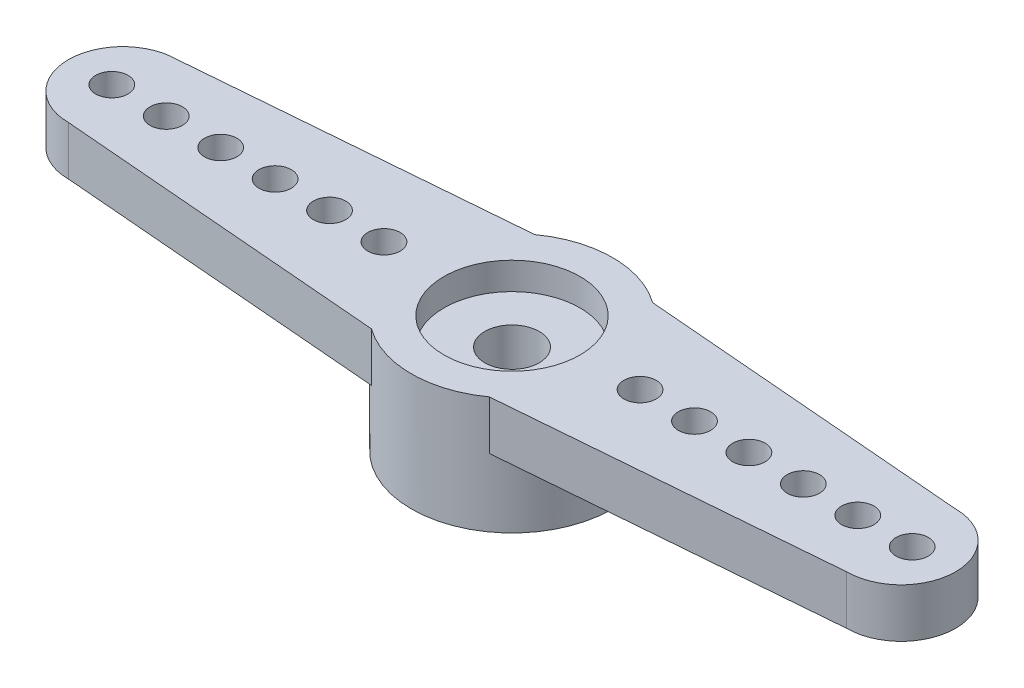
ISO-10303-21;
HEADER;
FILE_DESCRIPTION(('STEP AP214'),'2;1');
FILE_NAME('part.step','',(''),(''),'','','');
FILE_SCHEMA(('AUTOMOTIVE_DESIGN { 1 0 10303 214 1 1 1 1 }'));
ENDSEC;
DATA;
#1=APPLICATION_CONTEXT('core data for automotive mechanical design processes');
#2=APPLICATION_PROTOCOL_DEFINITION('international standard','automotive_design',2000,#1);
#3=PRODUCT_CONTEXT('',#1,'mechanical');
#4=PRODUCT('Part','Part','',(#3));
#5=PRODUCT_RELATED_PRODUCT_CATEGORY('part','',(#4));
#6=PRODUCT_DEFINITION_FORMATION('','',#4);
#7=PRODUCT_DEFINITION_CONTEXT('part definition',#1,'design');
#8=PRODUCT_DEFINITION('design','',#6,#7);
#9=PRODUCT_DEFINITION_SHAPE('','',#8);
#10=(LENGTH_UNIT() NAMED_UNIT(*) SI_UNIT(.MILLI.,.METRE.));
#11=(NAMED_UNIT(*) PLANE_ANGLE_UNIT() SI_UNIT($,.RADIAN.));
#12=(NAMED_UNIT(*) SI_UNIT($,.STERADIAN.) SOLID_ANGLE_UNIT());
#13=UNCERTAINTY_MEASURE_WITH_UNIT(LENGTH_MEASURE(1.E-05),#10,'distance_accuracy_value','');
#14=(GEOMETRIC_REPRESENTATION_CONTEXT(3) GLOBAL_UNCERTAINTY_ASSIGNED_CONTEXT((#13)) GLOBAL_UNIT_ASSIGNED_CONTEXT((#10,
#11,#12)) REPRESENTATION_CONTEXT('',''));
#15=CARTESIAN_POINT('',(0.,0.,0.));
#16=DIRECTION('',(0.,0.,1.));
#17=DIRECTION('',(1.,0.,0.));
#18=AXIS2_PLACEMENT_3D('',#15,#16,#17);
#19=CARTESIAN_POINT('',(0.,4.3,0.));
#20=DIRECTION('',(0.,-1.,0.));
#21=DIRECTION('',(0.,0.,-1.));
#22=AXIS2_PLACEMENT_3D('',#19,#20,#21);
#23=CYLINDRICAL_SURFACE('',#22,3.7);
#24=CARTESIAN_POINT('',(0.,4.3,0.));
#25=DIRECTION('',(0.,1.,0.));
#26=DIRECTION('',(0.,0.,1.));
#27=AXIS2_PLACEMENT_3D('',#24,#25,#26);
#28=CIRCLE('',#27,3.7);
#29=CARTESIAN_POINT('',(2.16564,4.3,-3.00000056506661));
#30=VERTEX_POINT('',#29);
#31=CARTESIAN_POINT('',(-2.16564,4.3,-3.00000056506661));
#32=VERTEX_POINT('',#31);
#33=EDGE_CURVE('E125',#30,#32,#28,.T.);
#34=ORIENTED_EDGE('',*,*,#33,.F.);
#35=DIRECTION('',(0.,1.,0.));
#36=VECTOR('',#35,1.);
#37=CARTESIAN_POINT('',(2.16564,2.5,-3.00000056506661));
#38=LINE('',#37,#36);
#39=CARTESIAN_POINT('',(2.16564,2.5,-3.00000056506661));
#40=VERTEX_POINT('',#39);
#41=EDGE_CURVE('E123',#40,#30,#38,.T.);
#42=ORIENTED_EDGE('',*,*,#41,.F.);
#43=CARTESIAN_POINT('',(0.,2.5,0.));
#44=DIRECTION('',(0.,-1.,0.));
#45=DIRECTION('',(0.,0.,-1.));
#46=AXIS2_PLACEMENT_3D('',#43,#44,#45);
#47=CIRCLE('',#46,3.7);
#48=CARTESIAN_POINT('',(2.16564,2.5,3.00000056506661));
#49=VERTEX_POINT('',#48);
#50=EDGE_CURVE('E11',#40,#49,#47,.T.);
#51=ORIENTED_EDGE('',*,*,#50,.T.);
#52=DIRECTION('',(0.,1.,0.));
#53=VECTOR('',#52,1.);
#54=CARTESIAN_POINT('',(2.16564,2.5,3.00000056506661));
#55=LINE('',#54,#53);
#56=CARTESIAN_POINT('',(2.16564,4.3,3.00000056506661));
#57=VERTEX_POINT('',#56);
#58=EDGE_CURVE('E101',#49,#57,#55,.T.);
#59=ORIENTED_EDGE('',*,*,#58,.T.);
#60=CARTESIAN_POINT('',(-2.16564,4.3,3.00000056506661));
#61=VERTEX_POINT('',#60);
#62=EDGE_CURVE('E176',#61,#57,#28,.T.);
#63=ORIENTED_EDGE('',*,*,#62,.F.);
#64=DIRECTION('',(0.,1.,0.));
#65=VECTOR('',#64,1.);
#66=CARTESIAN_POINT('',(-2.16564,2.5,3.00000056506661));
#67=LINE('',#66,#65);
#68=CARTESIAN_POINT('',(-2.16564,2.5,3.00000056506661));
#69=VERTEX_POINT('',#68);
#70=EDGE_CURVE('E153',#69,#61,#67,.T.);
#71=ORIENTED_EDGE('',*,*,#70,.F.);
#72=CARTESIAN_POINT('',(0.,2.5,0.));
#73=DIRECTION('',(0.,1.,0.));
#74=DIRECTION('',(0.,0.,1.));
#75=AXIS2_PLACEMENT_3D('',#72,#73,#74);
#76=CIRCLE('',#75,3.7);
#77=CARTESIAN_POINT('',(-2.16564,2.5,-3.00000056506661));
#78=VERTEX_POINT('',#77);
#79=EDGE_CURVE('E42',#78,#69,#76,.T.);
#80=ORIENTED_EDGE('',*,*,#79,.F.);
#81=DIRECTION('',(0.,1.,0.));
#82=VECTOR('',#81,1.);
#83=CARTESIAN_POINT('',(-2.16564,2.5,-3.00000056506661));
#84=LINE('',#83,#82);
#85=EDGE_CURVE('E150',#78,#32,#84,.T.);
#86=ORIENTED_EDGE('',*,*,#85,.T.);
#87=EDGE_LOOP('',(#34,#42,#51,#59,#63,#71,#80,#86));
#88=FACE_BOUND('',#87,.T.);
#89=CARTESIAN_POINT('',(0.,0.,0.));
#90=DIRECTION('',(0.,1.,0.));
#91=DIRECTION('',(0.,0.,1.));
#92=AXIS2_PLACEMENT_3D('',#89,#90,#91);
#93=CIRCLE('',#92,3.7);
#94=CARTESIAN_POINT('',(0.,0.,3.7));
#95=VERTEX_POINT('',#94);
#96=EDGE_CURVE('E173',#95,#95,#93,.T.);
#97=ORIENTED_EDGE('',*,*,#96,.T.);
#98=EDGE_LOOP('',(#97));
#99=FACE_BOUND('',#98,.T.);
#100=ADVANCED_FACE('F35',(#88,#99),#23,.T.);
#101=CARTESIAN_POINT('',(0.,4.3,0.));
#102=DIRECTION('',(0.,1.,0.));
#103=DIRECTION('',(0.,0.,1.));
#104=AXIS2_PLACEMENT_3D('',#101,#102,#103);
#105=PLANE('',#104);
#106=CARTESIAN_POINT('',(-12.705,4.3,0.));
#107=DIRECTION('',(0.,1.,0.));
#108=DIRECTION('',(0.,0.,1.));
#109=AXIS2_PLACEMENT_3D('',#106,#107,#108);
#110=CIRCLE('',#109,0.595);
#111=CARTESIAN_POINT('',(-12.705,4.3,0.595000000000002));
#112=VERTEX_POINT('',#111);
#113=EDGE_CURVE('E263',#112,#112,#110,.T.);
#114=ORIENTED_EDGE('',*,*,#113,.F.);
#115=EDGE_LOOP('',(#114));
#116=FACE_BOUND('',#115,.T.);
#117=CARTESIAN_POINT('',(-10.705,4.3,0.));
#118=DIRECTION('',(0.,1.,0.));
#119=DIRECTION('',(0.,0.,1.));
#120=AXIS2_PLACEMENT_3D('',#117,#118,#119);
#121=CIRCLE('',#120,0.595);
#122=CARTESIAN_POINT('',(-10.705,4.3,0.595000000000002));
#123=VERTEX_POINT('',#122);
#124=EDGE_CURVE('E257',#123,#123,#121,.T.);
#125=ORIENTED_EDGE('',*,*,#124,.F.);
#126=EDGE_LOOP('',(#125));
#127=FACE_BOUND('',#126,.T.);
#128=CARTESIAN_POINT('',(-8.705,4.3,0.));
#129=DIRECTION('',(0.,1.,0.));
#130=DIRECTION('',(0.,0.,1.));
#131=AXIS2_PLACEMENT_3D('',#128,#129,#130);
#132=CIRCLE('',#131,0.595);
#133=CARTESIAN_POINT('',(-8.705,4.3,0.595000000000002));
#134=VERTEX_POINT('',#133);
#135=EDGE_CURVE('E251',#134,#134,#132,.T.);
#136=ORIENTED_EDGE('',*,*,#135,.F.);
#137=EDGE_LOOP('',(#136));
#138=FACE_BOUND('',#137,.T.);
#139=CARTESIAN_POINT('',(-6.705,4.3,0.));
#140=DIRECTION('',(0.,1.,0.));
#141=DIRECTION('',(0.,0.,1.));
#142=AXIS2_PLACEMENT_3D('',#139,#140,#141);
#143=CIRCLE('',#142,0.595);
#144=CARTESIAN_POINT('',(-6.705,4.3,0.595000000000002));
#145=VERTEX_POINT('',#144);
#146=EDGE_CURVE('E245',#145,#145,#143,.T.);
#147=ORIENTED_EDGE('',*,*,#146,.F.);
#148=EDGE_LOOP('',(#147));
#149=FACE_BOUND('',#148,.T.);
#150=CARTESIAN_POINT('',(-4.705,4.3,0.));
#151=DIRECTION('',(0.,1.,0.));
#152=DIRECTION('',(0.,0.,1.));
#153=AXIS2_PLACEMENT_3D('',#150,#151,#152);
#154=CIRCLE('',#153,0.595);
#155=CARTESIAN_POINT('',(-4.705,4.3,0.595000000000002));
#156=VERTEX_POINT('',#155);
#157=EDGE_CURVE('E239',#156,#156,#154,.T.);
#158=ORIENTED_EDGE('',*,*,#157,.F.);
#159=EDGE_LOOP('',(#158));
#160=FACE_BOUND('',#159,.T.);
#161=CARTESIAN_POINT('',(14.705,4.3,0.));
#162=DIRECTION('',(0.,1.,0.));
#163=DIRECTION('',(0.,0.,-1.));
#164=AXIS2_PLACEMENT_3D('',#161,#162,#163);
#165=CIRCLE('',#164,0.595);
#166=CARTESIAN_POINT('',(14.705,4.3,-0.594999999999998));
#167=VERTEX_POINT('',#166);
#168=EDGE_CURVE('E233',#167,#167,#165,.T.);
#169=ORIENTED_EDGE('',*,*,#168,.F.);
#170=EDGE_LOOP('',(#169));
#171=FACE_BOUND('',#170,.T.);
#172=CARTESIAN_POINT('',(12.705,4.3,0.));
#173=DIRECTION('',(0.,1.,0.));
#174=DIRECTION('',(0.,0.,-1.));
#175=AXIS2_PLACEMENT_3D('',#172,#173,#174);
#176=CIRCLE('',#175,0.595);
#177=CARTESIAN_POINT('',(12.705,4.3,-0.594999999999998));
#178=VERTEX_POINT('',#177);
#179=EDGE_CURVE('E227',#178,#178,#176,.T.);
#180=ORIENTED_EDGE('',*,*,#179,.F.);
#181=EDGE_LOOP('',(#180));
#182=FACE_BOUND('',#181,.T.);
#183=CARTESIAN_POINT('',(10.705,4.3,0.));
#184=DIRECTION('',(0.,1.,0.));
#185=DIRECTION('',(0.,0.,-1.));
#186=AXIS2_PLACEMENT_3D('',#183,#184,#185);
#187=CIRCLE('',#186,0.595);
#188=CARTESIAN_POINT('',(10.705,4.3,-0.594999999999998));
#189=VERTEX_POINT('',#188);
#190=EDGE_CURVE('E221',#189,#189,#187,.T.);
#191=ORIENTED_EDGE('',*,*,#190,.F.);
#192=EDGE_LOOP('',(#191));
#193=FACE_BOUND('',#192,.T.);
#194=CARTESIAN_POINT('',(8.705,4.3,0.));
#195=DIRECTION('',(0.,1.,0.));
#196=DIRECTION('',(0.,0.,-1.));
#197=AXIS2_PLACEMENT_3D('',#194,#195,#196);
#198=CIRCLE('',#197,0.595);
#199=CARTESIAN_POINT('',(8.705,4.3,-0.594999999999998));
#200=VERTEX_POINT('',#199);
#201=EDGE_CURVE('E215',#200,#200,#198,.T.);
#202=ORIENTED_EDGE('',*,*,#201,.F.);
#203=EDGE_LOOP('',(#202));
#204=FACE_BOUND('',#203,.T.);
#205=CARTESIAN_POINT('',(6.705,4.3,0.));
#206=DIRECTION('',(0.,1.,0.));
#207=DIRECTION('',(0.,0.,-1.));
#208=AXIS2_PLACEMENT_3D('',#205,#206,#207);
#209=CIRCLE('',#208,0.595);
#210=CARTESIAN_POINT('',(6.705,4.3,-0.594999999999998));
#211=VERTEX_POINT('',#210);
#212=EDGE_CURVE('E209',#211,#211,#209,.T.);
#213=ORIENTED_EDGE('',*,*,#212,.F.);
#214=EDGE_LOOP('',(#213));
#215=FACE_BOUND('',#214,.T.);
#216=CARTESIAN_POINT('',(4.705,4.3,0.));
#217=DIRECTION('',(0.,1.,0.));
#218=DIRECTION('',(0.,0.,-1.));
#219=AXIS2_PLACEMENT_3D('',#216,#217,#218);
#220=CIRCLE('',#219,0.595);
#221=CARTESIAN_POINT('',(4.705,4.3,-0.594999999999998));
#222=VERTEX_POINT('',#221);
#223=EDGE_CURVE('E203',#222,#222,#220,.T.);
#224=ORIENTED_EDGE('',*,*,#223,.F.);
#225=EDGE_LOOP('',(#224));
#226=FACE_BOUND('',#225,.T.);
#227=CARTESIAN_POINT('',(-14.705,4.3,0.));
#228=DIRECTION('',(0.,1.,0.));
#229=DIRECTION('',(0.,0.,1.));
#230=AXIS2_PLACEMENT_3D('',#227,#228,#229);
#231=CIRCLE('',#230,0.595);
#232=CARTESIAN_POINT('',(-14.705,4.3,0.595000000000002));
#233=VERTEX_POINT('',#232);
#234=EDGE_CURVE('E195',#233,#233,#231,.T.);
#235=ORIENTED_EDGE('',*,*,#234,.F.);
#236=EDGE_LOOP('',(#235));
#237=FACE_BOUND('',#236,.T.);
#238=ORIENTED_EDGE('',*,*,#62,.T.);
#239=DIRECTION('',(0.996621441352037,0.,-0.0821322265459026));
#240=VECTOR('',#239,1.);
#241=CARTESIAN_POINT('',(2.16564,4.3,3.00000056506661));
#242=LINE('',#241,#240);
#243=CARTESIAN_POINT('',(14.3,4.3,2.));
#244=VERTEX_POINT('',#243);
#245=EDGE_CURVE('E106',#57,#244,#242,.T.);
#246=ORIENTED_EDGE('',*,*,#245,.T.);
#247=CARTESIAN_POINT('',(14.3,4.3,0.));
#248=DIRECTION('',(0.,1.,0.));
#249=DIRECTION('',(0.,0.,-1.));
#250=AXIS2_PLACEMENT_3D('',#247,#248,#249);
#251=CIRCLE('',#250,2.);
#252=CARTESIAN_POINT('',(14.3,4.3,-2.));
#253=VERTEX_POINT('',#252);
#254=EDGE_CURVE('E191',#244,#253,#251,.T.);
#255=ORIENTED_EDGE('',*,*,#254,.T.);
#256=DIRECTION('',(-0.996621441352037,0.,-0.0821322265459028));
#257=VECTOR('',#256,1.);
#258=CARTESIAN_POINT('',(2.16564,4.3,-3.00000056506661));
#259=LINE('',#258,#257);
#260=EDGE_CURVE('E49',#253,#30,#259,.T.);
#261=ORIENTED_EDGE('',*,*,#260,.T.);
#262=ORIENTED_EDGE('',*,*,#33,.T.);
#263=DIRECTION('',(-0.996621441352037,0.,0.0821322265459028));
#264=VECTOR('',#263,1.);
#265=CARTESIAN_POINT('',(-2.16564,4.3,-3.00000056506661));
#266=LINE('',#265,#264);
#267=CARTESIAN_POINT('',(-14.3,4.3,-2.));
#268=VERTEX_POINT('',#267);
#269=EDGE_CURVE('E127',#32,#268,#266,.T.);
#270=ORIENTED_EDGE('',*,*,#269,.T.);
#271=CARTESIAN_POINT('',(-14.3,4.3,0.));
#272=DIRECTION('',(0.,1.,0.));
#273=DIRECTION('',(0.,0.,1.));
#274=AXIS2_PLACEMENT_3D('',#271,#272,#273);
#275=CIRCLE('',#274,2.);
#276=CARTESIAN_POINT('',(-14.3,4.3,2.));
#277=VERTEX_POINT('',#276);
#278=EDGE_CURVE('E131',#268,#277,#275,.T.);
#279=ORIENTED_EDGE('',*,*,#278,.T.);
#280=DIRECTION('',(0.996621441352037,0.,0.0821322265459026));
#281=VECTOR('',#280,1.);
#282=CARTESIAN_POINT('',(-2.16564,4.3,3.00000056506661));
#283=LINE('',#282,#281);
#284=EDGE_CURVE('E56',#277,#61,#283,.T.);
#285=ORIENTED_EDGE('',*,*,#284,.T.);
#286=EDGE_LOOP('',(#238,#246,#255,#261,#262,#270,#279,#285));
#287=FACE_BOUND('',#286,.T.);
#288=CARTESIAN_POINT('',(0.,4.3,0.));
#289=DIRECTION('',(0.,1.,0.));
#290=DIRECTION('',(0.,0.,1.));
#291=AXIS2_PLACEMENT_3D('',#288,#289,#290);
#292=CIRCLE('',#291,2.5);
#293=CARTESIAN_POINT('',(0.,4.3,2.5));
#294=VERTEX_POINT('',#293);
#295=EDGE_CURVE('E161',#294,#294,#292,.T.);
#296=ORIENTED_EDGE('',*,*,#295,.F.);
#297=EDGE_LOOP('',(#296));
#298=FACE_BOUND('',#297,.T.);
#299=ADVANCED_FACE('F188',(#116,#127,#138,#149,#160,#171,#182,#193,#204,#215,#226,#237,#287,
#298),#105,.T.);
#300=CARTESIAN_POINT('',(0.,0.,0.));
#301=DIRECTION('',(0.,1.,0.));
#302=DIRECTION('',(0.,0.,1.));
#303=AXIS2_PLACEMENT_3D('',#300,#301,#302);
#304=PLANE('',#303);
#305=CARTESIAN_POINT('',(0.,0.,0.));
#306=DIRECTION('',(0.,-1.,0.));
#307=DIRECTION('',(0.,0.,-1.));
#308=AXIS2_PLACEMENT_3D('',#305,#306,#307);
#309=CIRCLE('',#308,2.5);
#310=CARTESIAN_POINT('',(0.,0.,-2.5));
#311=VERTEX_POINT('',#310);
#312=EDGE_CURVE('E167',#311,#311,#309,.T.);
#313=ORIENTED_EDGE('',*,*,#312,.F.);
#314=EDGE_LOOP('',(#313));
#315=FACE_BOUND('',#314,.T.);
#316=ORIENTED_EDGE('',*,*,#96,.F.);
#317=EDGE_LOOP('',(#316));
#318=FACE_BOUND('',#317,.T.);
#319=ADVANCED_FACE('F280',(#315,#318),#304,.F.);
#320=CARTESIAN_POINT('',(0.,1.5,0.));
#321=DIRECTION('',(0.,-1.,0.));
#322=DIRECTION('',(0.,0.,-1.));
#323=AXIS2_PLACEMENT_3D('',#320,#321,#322);
#324=CYLINDRICAL_SURFACE('',#323,2.5);
#325=CARTESIAN_POINT('',(0.,1.5,0.));
#326=DIRECTION('',(0.,-1.,0.));
#327=DIRECTION('',(0.,0.,-1.));
#328=AXIS2_PLACEMENT_3D('',#325,#326,#327);
#329=CIRCLE('',#328,2.5);
#330=CARTESIAN_POINT('',(0.,1.5,-2.5));
#331=VERTEX_POINT('',#330);
#332=EDGE_CURVE('E170',#331,#331,#329,.T.);
#333=ORIENTED_EDGE('',*,*,#332,.F.);
#334=EDGE_LOOP('',(#333));
#335=FACE_BOUND('',#334,.T.);
#336=ORIENTED_EDGE('',*,*,#312,.T.);
#337=EDGE_LOOP('',(#336));
#338=FACE_BOUND('',#337,.T.);
#339=ADVANCED_FACE('F554',(#335,#338),#324,.F.);
#340=CARTESIAN_POINT('',(0.,1.5,0.));
#341=DIRECTION('',(0.,-1.,0.));
#342=DIRECTION('',(0.,0.,-1.));
#343=AXIS2_PLACEMENT_3D('',#340,#341,#342);
#344=PLANE('',#343);
#345=CARTESIAN_POINT('',(0.,1.5,0.));
#346=DIRECTION('',(0.,1.,0.));
#347=DIRECTION('',(0.,0.,1.));
#348=AXIS2_PLACEMENT_3D('',#345,#346,#347);
#349=CIRCLE('',#348,1.);
#350=CARTESIAN_POINT('',(0.,1.5,1.));
#351=VERTEX_POINT('',#350);
#352=EDGE_CURVE('E158',#351,#351,#349,.T.);
#353=ORIENTED_EDGE('',*,*,#352,.T.);
#354=EDGE_LOOP('',(#353));
#355=FACE_BOUND('',#354,.T.);
#356=ORIENTED_EDGE('',*,*,#332,.T.);
#357=EDGE_LOOP('',(#356));
#358=FACE_BOUND('',#357,.T.);
#359=ADVANCED_FACE('F550',(#355,#358),#344,.T.);
#360=CARTESIAN_POINT('',(0.,3.3,0.));
#361=DIRECTION('',(0.,1.,0.));
#362=DIRECTION('',(0.,0.,1.));
#363=AXIS2_PLACEMENT_3D('',#360,#361,#362);
#364=CYLINDRICAL_SURFACE('',#363,2.5);
#365=CARTESIAN_POINT('',(0.,3.3,0.));
#366=DIRECTION('',(0.,1.,0.));
#367=DIRECTION('',(0.,0.,1.));
#368=AXIS2_PLACEMENT_3D('',#365,#366,#367);
#369=CIRCLE('',#368,2.5);
#370=CARTESIAN_POINT('',(0.,3.3,2.5));
#371=VERTEX_POINT('',#370);
#372=EDGE_CURVE('E164',#371,#371,#369,.T.);
#373=ORIENTED_EDGE('',*,*,#372,.F.);
#374=EDGE_LOOP('',(#373));
#375=FACE_BOUND('',#374,.T.);
#376=ORIENTED_EDGE('',*,*,#295,.T.);
#377=EDGE_LOOP('',(#376));
#378=FACE_BOUND('',#377,.T.);
#379=ADVANCED_FACE('F546',(#375,#378),#364,.F.);
#380=CARTESIAN_POINT('',(0.,3.3,0.));
#381=DIRECTION('',(0.,1.,0.));
#382=DIRECTION('',(0.,0.,1.));
#383=AXIS2_PLACEMENT_3D('',#380,#381,#382);
#384=PLANE('',#383);
#385=CARTESIAN_POINT('',(0.,3.3,0.));
#386=DIRECTION('',(0.,1.,0.));
#387=DIRECTION('',(0.,0.,1.));
#388=AXIS2_PLACEMENT_3D('',#385,#386,#387);
#389=CIRCLE('',#388,1.);
#390=CARTESIAN_POINT('',(0.,3.3,1.));
#391=VERTEX_POINT('',#390);
#392=EDGE_CURVE('E152',#391,#391,#389,.T.);
#393=ORIENTED_EDGE('',*,*,#392,.F.);
#394=EDGE_LOOP('',(#393));
#395=FACE_BOUND('',#394,.T.);
#396=ORIENTED_EDGE('',*,*,#372,.T.);
#397=EDGE_LOOP('',(#396));
#398=FACE_BOUND('',#397,.T.);
#399=ADVANCED_FACE('F542',(#395,#398),#384,.T.);
#400=CARTESIAN_POINT('',(0.,1.5,0.));
#401=DIRECTION('',(0.,1.,0.));
#402=DIRECTION('',(0.,0.,1.));
#403=AXIS2_PLACEMENT_3D('',#400,#401,#402);
#404=CYLINDRICAL_SURFACE('',#403,1.);
#405=ORIENTED_EDGE('',*,*,#352,.F.);
#406=EDGE_LOOP('',(#405));
#407=FACE_BOUND('',#406,.T.);
#408=ORIENTED_EDGE('',*,*,#392,.T.);
#409=EDGE_LOOP('',(#408));
#410=FACE_BOUND('',#409,.T.);
#411=ADVANCED_FACE('F327',(#407,#410),#404,.F.);
#412=CARTESIAN_POINT('',(-2.16564,2.5,-3.00000056506661));
#413=DIRECTION('',(-0.0821322265459028,0.,-0.996621441352037));
#414=DIRECTION('',(-0.996621441352037,0.,0.0821322265459028));
#415=AXIS2_PLACEMENT_3D('',#412,#413,#414);
#416=PLANE('',#415);
#417=ORIENTED_EDGE('',*,*,#269,.F.);
#418=ORIENTED_EDGE('',*,*,#85,.F.);
#419=DIRECTION('',(-0.996621441352037,0.,0.0821322265459028));
#420=VECTOR('',#419,1.);
#421=CARTESIAN_POINT('',(-2.16564,2.5,-3.00000056506661));
#422=LINE('',#421,#420);
#423=CARTESIAN_POINT('',(-14.3,2.5,-2.));
#424=VERTEX_POINT('',#423);
#425=EDGE_CURVE('E138',#78,#424,#422,.T.);
#426=ORIENTED_EDGE('',*,*,#425,.T.);
#427=DIRECTION('',(0.,1.,0.));
#428=VECTOR('',#427,1.);
#429=CARTESIAN_POINT('',(-14.3,2.5,-2.));
#430=LINE('',#429,#428);
#431=EDGE_CURVE('E146',#424,#268,#430,.T.);
#432=ORIENTED_EDGE('',*,*,#431,.T.);
#433=EDGE_LOOP('',(#417,#418,#426,#432));
#434=FACE_BOUND('',#433,.T.);
#435=ADVANCED_FACE('F332',(#434),#416,.T.);
#436=CARTESIAN_POINT('',(-2.16564,2.5,3.00000056506661));
#437=DIRECTION('',(-0.0821322265459026,0.,0.996621441352037));
#438=DIRECTION('',(0.996621441352037,0.,0.0821322265459026));
#439=AXIS2_PLACEMENT_3D('',#436,#437,#438);
#440=PLANE('',#439);
#441=ORIENTED_EDGE('',*,*,#284,.F.);
#442=DIRECTION('',(0.,1.,0.));
#443=VECTOR('',#442,1.);
#444=CARTESIAN_POINT('',(-14.3,2.5,2.));
#445=LINE('',#444,#443);
#446=CARTESIAN_POINT('',(-14.3,2.5,2.));
#447=VERTEX_POINT('',#446);
#448=EDGE_CURVE('E155',#447,#277,#445,.T.);
#449=ORIENTED_EDGE('',*,*,#448,.F.);
#450=DIRECTION('',(0.996621441352037,0.,0.0821322265459026));
#451=VECTOR('',#450,1.);
#452=CARTESIAN_POINT('',(-2.16564,2.5,3.00000056506661));
#453=LINE('',#452,#451);
#454=EDGE_CURVE('E144',#447,#69,#453,.T.);
#455=ORIENTED_EDGE('',*,*,#454,.T.);
#456=ORIENTED_EDGE('',*,*,#70,.T.);
#457=EDGE_LOOP('',(#441,#449,#455,#456));
#458=FACE_BOUND('',#457,.T.);
#459=ADVANCED_FACE('F187',(#458),#440,.T.);
#460=CARTESIAN_POINT('',(-14.3,2.5,0.));
#461=DIRECTION('',(0.,1.,0.));
#462=DIRECTION('',(0.,0.,1.));
#463=AXIS2_PLACEMENT_3D('',#460,#461,#462);
#464=CYLINDRICAL_SURFACE('',#463,2.);
#465=ORIENTED_EDGE('',*,*,#278,.F.);
#466=ORIENTED_EDGE('',*,*,#431,.F.);
#467=CARTESIAN_POINT('',(-14.3,2.5,0.));
#468=DIRECTION('',(0.,1.,0.));
#469=DIRECTION('',(0.,0.,1.));
#470=AXIS2_PLACEMENT_3D('',#467,#468,#469);
#471=CIRCLE('',#470,2.);
#472=EDGE_CURVE('E141',#424,#447,#471,.T.);
#473=ORIENTED_EDGE('',*,*,#472,.T.);
#474=ORIENTED_EDGE('',*,*,#448,.T.);
#475=EDGE_LOOP('',(#465,#466,#473,#474));
#476=FACE_BOUND('',#475,.T.);
#477=ADVANCED_FACE('F347',(#476),#464,.T.);
#478=CARTESIAN_POINT('',(-14.3,2.5,0.));
#479=DIRECTION('',(0.,1.,0.));
#480=DIRECTION('',(0.,0.,1.));
#481=AXIS2_PLACEMENT_3D('',#478,#479,#480);
#482=PLANE('',#481);
#483=CARTESIAN_POINT('',(-12.705,2.5,0.));
#484=DIRECTION('',(0.,1.,0.));
#485=DIRECTION('',(0.,0.,1.));
#486=AXIS2_PLACEMENT_3D('',#483,#484,#485);
#487=CIRCLE('',#486,0.595);
#488=CARTESIAN_POINT('',(-12.705,2.5,0.595000000000002));
#489=VERTEX_POINT('',#488);
#490=EDGE_CURVE('E201',#489,#489,#487,.T.);
#491=ORIENTED_EDGE('',*,*,#490,.T.);
#492=EDGE_LOOP('',(#491));
#493=FACE_BOUND('',#492,.T.);
#494=CARTESIAN_POINT('',(-10.705,2.5,0.));
#495=DIRECTION('',(0.,1.,0.));
#496=DIRECTION('',(0.,0.,1.));
#497=AXIS2_PLACEMENT_3D('',#494,#495,#496);
#498=CIRCLE('',#497,0.595);
#499=CARTESIAN_POINT('',(-10.705,2.5,0.595000000000002));
#500=VERTEX_POINT('',#499);
#501=EDGE_CURVE('E260',#500,#500,#498,.T.);
#502=ORIENTED_EDGE('',*,*,#501,.T.);
#503=EDGE_LOOP('',(#502));
#504=FACE_BOUND('',#503,.T.);
#505=CARTESIAN_POINT('',(-8.705,2.5,0.));
#506=DIRECTION('',(0.,1.,0.));
#507=DIRECTION('',(0.,0.,1.));
#508=AXIS2_PLACEMENT_3D('',#505,#506,#507);
#509=CIRCLE('',#508,0.595);
#510=CARTESIAN_POINT('',(-8.705,2.5,0.595000000000002));
#511=VERTEX_POINT('',#510);
#512=EDGE_CURVE('E254',#511,#511,#509,.T.);
#513=ORIENTED_EDGE('',*,*,#512,.T.);
#514=EDGE_LOOP('',(#513));
#515=FACE_BOUND('',#514,.T.);
#516=CARTESIAN_POINT('',(-6.705,2.5,0.));
#517=DIRECTION('',(0.,1.,0.));
#518=DIRECTION('',(0.,0.,1.));
#519=AXIS2_PLACEMENT_3D('',#516,#517,#518);
#520=CIRCLE('',#519,0.595);
#521=CARTESIAN_POINT('',(-6.705,2.5,0.595000000000002));
#522=VERTEX_POINT('',#521);
#523=EDGE_CURVE('E248',#522,#522,#520,.T.);
#524=ORIENTED_EDGE('',*,*,#523,.T.);
#525=EDGE_LOOP('',(#524));
#526=FACE_BOUND('',#525,.T.);
#527=CARTESIAN_POINT('',(-4.705,2.5,0.));
#528=DIRECTION('',(0.,1.,0.));
#529=DIRECTION('',(0.,0.,1.));
#530=AXIS2_PLACEMENT_3D('',#527,#528,#529);
#531=CIRCLE('',#530,0.595);
#532=CARTESIAN_POINT('',(-4.705,2.5,0.595000000000002));
#533=VERTEX_POINT('',#532);
#534=EDGE_CURVE('E242',#533,#533,#531,.T.);
#535=ORIENTED_EDGE('',*,*,#534,.T.);
#536=EDGE_LOOP('',(#535));
#537=FACE_BOUND('',#536,.T.);
#538=CARTESIAN_POINT('',(-14.705,2.5,0.));
#539=DIRECTION('',(0.,1.,0.));
#540=DIRECTION('',(0.,0.,1.));
#541=AXIS2_PLACEMENT_3D('',#538,#539,#540);
#542=CIRCLE('',#541,0.595);
#543=CARTESIAN_POINT('',(-14.705,2.5,0.595000000000002));
#544=VERTEX_POINT('',#543);
#545=EDGE_CURVE('E192',#544,#544,#542,.T.);
#546=ORIENTED_EDGE('',*,*,#545,.T.);
#547=EDGE_LOOP('',(#546));
#548=FACE_BOUND('',#547,.T.);
#549=ORIENTED_EDGE('',*,*,#425,.F.);
#550=ORIENTED_EDGE('',*,*,#79,.T.);
#551=ORIENTED_EDGE('',*,*,#454,.F.);
#552=ORIENTED_EDGE('',*,*,#472,.F.);
#553=EDGE_LOOP('',(#549,#550,#551,#552));
#554=FACE_BOUND('',#553,.T.);
#555=ADVANCED_FACE('F183',(#493,#504,#515,#526,#537,#548,#554),#482,.F.);
#556=CARTESIAN_POINT('',(2.16564,2.5,-3.00000056506661));
#557=DIRECTION('',(0.0821322265459028,0.,-0.996621441352037));
#558=DIRECTION('',(-0.996621441352037,0.,-0.0821322265459028));
#559=AXIS2_PLACEMENT_3D('',#556,#557,#558);
#560=PLANE('',#559);
#561=ORIENTED_EDGE('',*,*,#260,.F.);
#562=DIRECTION('',(0.,1.,0.));
#563=VECTOR('',#562,1.);
#564=CARTESIAN_POINT('',(14.3,2.5,-2.));
#565=LINE('',#564,#563);
#566=CARTESIAN_POINT('',(14.3,2.5,-2.));
#567=VERTEX_POINT('',#566);
#568=EDGE_CURVE('E128',#567,#253,#565,.T.);
#569=ORIENTED_EDGE('',*,*,#568,.F.);
#570=DIRECTION('',(-0.996621441352037,0.,-0.0821322265459028));
#571=VECTOR('',#570,1.);
#572=CARTESIAN_POINT('',(2.16564,2.5,-3.00000056506661));
#573=LINE('',#572,#571);
#574=EDGE_CURVE('E110',#567,#40,#573,.T.);
#575=ORIENTED_EDGE('',*,*,#574,.T.);
#576=ORIENTED_EDGE('',*,*,#41,.T.);
#577=EDGE_LOOP('',(#561,#569,#575,#576));
#578=FACE_BOUND('',#577,.T.);
#579=ADVANCED_FACE('F363',(#578),#560,.T.);
#580=CARTESIAN_POINT('',(14.3,2.5,0.));
#581=DIRECTION('',(0.,1.,0.));
#582=DIRECTION('',(0.,0.,1.));
#583=AXIS2_PLACEMENT_3D('',#580,#581,#582);
#584=CYLINDRICAL_SURFACE('',#583,2.);
#585=ORIENTED_EDGE('',*,*,#254,.F.);
#586=DIRECTION('',(0.,1.,0.));
#587=VECTOR('',#586,1.);
#588=CARTESIAN_POINT('',(14.3,2.5,2.));
#589=LINE('',#588,#587);
#590=CARTESIAN_POINT('',(14.3,2.5,2.));
#591=VERTEX_POINT('',#590);
#592=EDGE_CURVE('E109',#591,#244,#589,.T.);
#593=ORIENTED_EDGE('',*,*,#592,.F.);
#594=CARTESIAN_POINT('',(14.3,2.5,0.));
#595=DIRECTION('',(0.,1.,0.));
#596=DIRECTION('',(0.,0.,-1.));
#597=AXIS2_PLACEMENT_3D('',#594,#595,#596);
#598=CIRCLE('',#597,2.);
#599=EDGE_CURVE('E118',#591,#567,#598,.T.);
#600=ORIENTED_EDGE('',*,*,#599,.T.);
#601=ORIENTED_EDGE('',*,*,#568,.T.);
#602=EDGE_LOOP('',(#585,#593,#600,#601));
#603=FACE_BOUND('',#602,.T.);
#604=ADVANCED_FACE('F368',(#603),#584,.T.);
#605=CARTESIAN_POINT('',(2.16564,2.5,3.00000056506661));
#606=DIRECTION('',(0.0821322265459026,0.,0.996621441352037));
#607=DIRECTION('',(0.996621441352037,0.,-0.0821322265459026));
#608=AXIS2_PLACEMENT_3D('',#605,#606,#607);
#609=PLANE('',#608);
#610=ORIENTED_EDGE('',*,*,#245,.F.);
#611=ORIENTED_EDGE('',*,*,#58,.F.);
#612=DIRECTION('',(0.996621441352037,0.,-0.0821322265459026));
#613=VECTOR('',#612,1.);
#614=CARTESIAN_POINT('',(2.16564,2.5,3.00000056506661));
#615=LINE('',#614,#613);
#616=EDGE_CURVE('E104',#49,#591,#615,.T.);
#617=ORIENTED_EDGE('',*,*,#616,.T.);
#618=ORIENTED_EDGE('',*,*,#592,.T.);
#619=EDGE_LOOP('',(#610,#611,#617,#618));
#620=FACE_BOUND('',#619,.T.);
#621=ADVANCED_FACE('F103',(#620),#609,.T.);
#622=CARTESIAN_POINT('',(14.3,2.5,0.));
#623=DIRECTION('',(0.,-1.,0.));
#624=DIRECTION('',(0.,0.,-1.));
#625=AXIS2_PLACEMENT_3D('',#622,#623,#624);
#626=PLANE('',#625);
#627=CARTESIAN_POINT('',(14.705,2.5,0.));
#628=DIRECTION('',(0.,1.,0.));
#629=DIRECTION('',(0.,0.,-1.));
#630=AXIS2_PLACEMENT_3D('',#627,#628,#629);
#631=CIRCLE('',#630,0.595);
#632=CARTESIAN_POINT('',(14.705,2.5,-0.594999999999998));
#633=VERTEX_POINT('',#632);
#634=EDGE_CURVE('E236',#633,#633,#631,.T.);
#635=ORIENTED_EDGE('',*,*,#634,.T.);
#636=EDGE_LOOP('',(#635));
#637=FACE_BOUND('',#636,.T.);
#638=CARTESIAN_POINT('',(12.705,2.5,0.));
#639=DIRECTION('',(0.,1.,0.));
#640=DIRECTION('',(0.,0.,-1.));
#641=AXIS2_PLACEMENT_3D('',#638,#639,#640);
#642=CIRCLE('',#641,0.595);
#643=CARTESIAN_POINT('',(12.705,2.5,-0.594999999999998));
#644=VERTEX_POINT('',#643);
#645=EDGE_CURVE('E230',#644,#644,#642,.T.);
#646=ORIENTED_EDGE('',*,*,#645,.T.);
#647=EDGE_LOOP('',(#646));
#648=FACE_BOUND('',#647,.T.);
#649=CARTESIAN_POINT('',(10.705,2.5,0.));
#650=DIRECTION('',(0.,1.,0.));
#651=DIRECTION('',(0.,0.,-1.));
#652=AXIS2_PLACEMENT_3D('',#649,#650,#651);
#653=CIRCLE('',#652,0.595);
#654=CARTESIAN_POINT('',(10.705,2.5,-0.594999999999998));
#655=VERTEX_POINT('',#654);
#656=EDGE_CURVE('E224',#655,#655,#653,.T.);
#657=ORIENTED_EDGE('',*,*,#656,.T.);
#658=EDGE_LOOP('',(#657));
#659=FACE_BOUND('',#658,.T.);
#660=CARTESIAN_POINT('',(8.705,2.5,0.));
#661=DIRECTION('',(0.,1.,0.));
#662=DIRECTION('',(0.,0.,-1.));
#663=AXIS2_PLACEMENT_3D('',#660,#661,#662);
#664=CIRCLE('',#663,0.595);
#665=CARTESIAN_POINT('',(8.705,2.5,-0.594999999999998));
#666=VERTEX_POINT('',#665);
#667=EDGE_CURVE('E218',#666,#666,#664,.T.);
#668=ORIENTED_EDGE('',*,*,#667,.T.);
#669=EDGE_LOOP('',(#668));
#670=FACE_BOUND('',#669,.T.);
#671=CARTESIAN_POINT('',(6.705,2.5,0.));
#672=DIRECTION('',(0.,1.,0.));
#673=DIRECTION('',(0.,0.,-1.));
#674=AXIS2_PLACEMENT_3D('',#671,#672,#673);
#675=CIRCLE('',#674,0.595);
#676=CARTESIAN_POINT('',(6.705,2.5,-0.594999999999998));
#677=VERTEX_POINT('',#676);
#678=EDGE_CURVE('E212',#677,#677,#675,.T.);
#679=ORIENTED_EDGE('',*,*,#678,.T.);
#680=EDGE_LOOP('',(#679));
#681=FACE_BOUND('',#680,.T.);
#682=CARTESIAN_POINT('',(4.705,2.5,0.));
#683=DIRECTION('',(0.,1.,0.));
#684=DIRECTION('',(0.,0.,-1.));
#685=AXIS2_PLACEMENT_3D('',#682,#683,#684);
#686=CIRCLE('',#685,0.595);
#687=CARTESIAN_POINT('',(4.705,2.5,-0.594999999999998));
#688=VERTEX_POINT('',#687);
#689=EDGE_CURVE('E206',#688,#688,#686,.T.);
#690=ORIENTED_EDGE('',*,*,#689,.T.);
#691=EDGE_LOOP('',(#690));
#692=FACE_BOUND('',#691,.T.);
#693=ORIENTED_EDGE('',*,*,#50,.F.);
#694=ORIENTED_EDGE('',*,*,#574,.F.);
#695=ORIENTED_EDGE('',*,*,#599,.F.);
#696=ORIENTED_EDGE('',*,*,#616,.F.);
#697=EDGE_LOOP('',(#693,#694,#695,#696));
#698=FACE_BOUND('',#697,.T.);
#699=ADVANCED_FACE('F114',(#637,#648,#659,#670,#681,#692,#698),#626,.T.);
#700=CARTESIAN_POINT('',(-14.705,2.5,0.));
#701=DIRECTION('',(0.,1.,0.));
#702=DIRECTION('',(0.,0.,1.));
#703=AXIS2_PLACEMENT_3D('',#700,#701,#702);
#704=CYLINDRICAL_SURFACE('',#703,0.595);
#705=ORIENTED_EDGE('',*,*,#545,.F.);
#706=EDGE_LOOP('',(#705));
#707=FACE_BOUND('',#706,.T.);
#708=ORIENTED_EDGE('',*,*,#234,.T.);
#709=EDGE_LOOP('',(#708));
#710=FACE_BOUND('',#709,.T.);
#711=ADVANCED_FACE('F304',(#707,#710),#704,.F.);
#712=CARTESIAN_POINT('',(4.705,2.5,0.));
#713=DIRECTION('',(0.,1.,0.));
#714=DIRECTION('',(0.,0.,1.));
#715=AXIS2_PLACEMENT_3D('',#712,#713,#714);
#716=CYLINDRICAL_SURFACE('',#715,0.595);
#717=ORIENTED_EDGE('',*,*,#689,.F.);
#718=EDGE_LOOP('',(#717));
#719=FACE_BOUND('',#718,.T.);
#720=ORIENTED_EDGE('',*,*,#223,.T.);
#721=EDGE_LOOP('',(#720));
#722=FACE_BOUND('',#721,.T.);
#723=ADVANCED_FACE('F306',(#719,#722),#716,.F.);
#724=CARTESIAN_POINT('',(6.705,2.5,0.));
#725=DIRECTION('',(0.,1.,0.));
#726=DIRECTION('',(0.,0.,1.));
#727=AXIS2_PLACEMENT_3D('',#724,#725,#726);
#728=CYLINDRICAL_SURFACE('',#727,0.595);
#729=ORIENTED_EDGE('',*,*,#678,.F.);
#730=EDGE_LOOP('',(#729));
#731=FACE_BOUND('',#730,.T.);
#732=ORIENTED_EDGE('',*,*,#212,.T.);
#733=EDGE_LOOP('',(#732));
#734=FACE_BOUND('',#733,.T.);
#735=ADVANCED_FACE('F313',(#731,#734),#728,.F.);
#736=CARTESIAN_POINT('',(8.705,2.5,0.));
#737=DIRECTION('',(0.,1.,0.));
#738=DIRECTION('',(0.,0.,1.));
#739=AXIS2_PLACEMENT_3D('',#736,#737,#738);
#740=CYLINDRICAL_SURFACE('',#739,0.595);
#741=ORIENTED_EDGE('',*,*,#667,.F.);
#742=EDGE_LOOP('',(#741));
#743=FACE_BOUND('',#742,.T.);
#744=ORIENTED_EDGE('',*,*,#201,.T.);
#745=EDGE_LOOP('',(#744));
#746=FACE_BOUND('',#745,.T.);
#747=ADVANCED_FACE('F422',(#743,#746),#740,.F.);
#748=CARTESIAN_POINT('',(10.705,2.5,0.));
#749=DIRECTION('',(0.,1.,0.));
#750=DIRECTION('',(0.,0.,1.));
#751=AXIS2_PLACEMENT_3D('',#748,#749,#750);
#752=CYLINDRICAL_SURFACE('',#751,0.595);
#753=ORIENTED_EDGE('',*,*,#656,.F.);
#754=EDGE_LOOP('',(#753));
#755=FACE_BOUND('',#754,.T.);
#756=ORIENTED_EDGE('',*,*,#190,.T.);
#757=EDGE_LOOP('',(#756));
#758=FACE_BOUND('',#757,.T.);
#759=ADVANCED_FACE('F432',(#755,#758),#752,.F.);
#760=CARTESIAN_POINT('',(12.705,2.5,0.));
#761=DIRECTION('',(0.,1.,0.));
#762=DIRECTION('',(0.,0.,1.));
#763=AXIS2_PLACEMENT_3D('',#760,#761,#762);
#764=CYLINDRICAL_SURFACE('',#763,0.595);
#765=ORIENTED_EDGE('',*,*,#645,.F.);
#766=EDGE_LOOP('',(#765));
#767=FACE_BOUND('',#766,.T.);
#768=ORIENTED_EDGE('',*,*,#179,.T.);
#769=EDGE_LOOP('',(#768));
#770=FACE_BOUND('',#769,.T.);
#771=ADVANCED_FACE('F442',(#767,#770),#764,.F.);
#772=CARTESIAN_POINT('',(14.705,2.5,0.));
#773=DIRECTION('',(0.,1.,0.));
#774=DIRECTION('',(0.,0.,1.));
#775=AXIS2_PLACEMENT_3D('',#772,#773,#774);
#776=CYLINDRICAL_SURFACE('',#775,0.595);
#777=ORIENTED_EDGE('',*,*,#634,.F.);
#778=EDGE_LOOP('',(#777));
#779=FACE_BOUND('',#778,.T.);
#780=ORIENTED_EDGE('',*,*,#168,.T.);
#781=EDGE_LOOP('',(#780));
#782=FACE_BOUND('',#781,.T.);
#783=ADVANCED_FACE('F452',(#779,#782),#776,.F.);
#784=CARTESIAN_POINT('',(-4.705,2.5,0.));
#785=DIRECTION('',(0.,1.,0.));
#786=DIRECTION('',(0.,0.,1.));
#787=AXIS2_PLACEMENT_3D('',#784,#785,#786);
#788=CYLINDRICAL_SURFACE('',#787,0.595);
#789=ORIENTED_EDGE('',*,*,#534,.F.);
#790=EDGE_LOOP('',(#789));
#791=FACE_BOUND('',#790,.T.);
#792=ORIENTED_EDGE('',*,*,#157,.T.);
#793=EDGE_LOOP('',(#792));
#794=FACE_BOUND('',#793,.T.);
#795=ADVANCED_FACE('F462',(#791,#794),#788,.F.);
#796=CARTESIAN_POINT('',(-6.705,2.5,0.));
#797=DIRECTION('',(0.,1.,0.));
#798=DIRECTION('',(0.,0.,1.));
#799=AXIS2_PLACEMENT_3D('',#796,#797,#798);
#800=CYLINDRICAL_SURFACE('',#799,0.595);
#801=ORIENTED_EDGE('',*,*,#523,.F.);
#802=EDGE_LOOP('',(#801));
#803=FACE_BOUND('',#802,.T.);
#804=ORIENTED_EDGE('',*,*,#146,.T.);
#805=EDGE_LOOP('',(#804));
#806=FACE_BOUND('',#805,.T.);
#807=ADVANCED_FACE('F472',(#803,#806),#800,.F.);
#808=CARTESIAN_POINT('',(-8.705,2.5,0.));
#809=DIRECTION('',(0.,1.,0.));
#810=DIRECTION('',(0.,0.,1.));
#811=AXIS2_PLACEMENT_3D('',#808,#809,#810);
#812=CYLINDRICAL_SURFACE('',#811,0.595);
#813=ORIENTED_EDGE('',*,*,#512,.F.);
#814=EDGE_LOOP('',(#813));
#815=FACE_BOUND('',#814,.T.);
#816=ORIENTED_EDGE('',*,*,#135,.T.);
#817=EDGE_LOOP('',(#816));
#818=FACE_BOUND('',#817,.T.);
#819=ADVANCED_FACE('F482',(#815,#818),#812,.F.);
#820=CARTESIAN_POINT('',(-10.705,2.5,0.));
#821=DIRECTION('',(0.,1.,0.));
#822=DIRECTION('',(0.,0.,1.));
#823=AXIS2_PLACEMENT_3D('',#820,#821,#822);
#824=CYLINDRICAL_SURFACE('',#823,0.595);
#825=ORIENTED_EDGE('',*,*,#501,.F.);
#826=EDGE_LOOP('',(#825));
#827=FACE_BOUND('',#826,.T.);
#828=ORIENTED_EDGE('',*,*,#124,.T.);
#829=EDGE_LOOP('',(#828));
#830=FACE_BOUND('',#829,.T.);
#831=ADVANCED_FACE('F274',(#827,#830),#824,.F.);
#832=CARTESIAN_POINT('',(-12.705,2.5,0.));
#833=DIRECTION('',(0.,1.,0.));
#834=DIRECTION('',(0.,0.,1.));
#835=AXIS2_PLACEMENT_3D('',#832,#833,#834);
#836=CYLINDRICAL_SURFACE('',#835,0.595);
#837=ORIENTED_EDGE('',*,*,#490,.F.);
#838=EDGE_LOOP('',(#837));
#839=FACE_BOUND('',#838,.T.);
#840=ORIENTED_EDGE('',*,*,#113,.T.);
#841=EDGE_LOOP('',(#840));
#842=FACE_BOUND('',#841,.T.);
#843=ADVANCED_FACE('F271',(#839,#842),#836,.F.);
#844=CLOSED_SHELL('',(#100,#299,#319,#339,#359,#379,#399,#411,#435,#459,#477,#555,#579,#604,
#621,#699,#711,#723,#735,#747,#759,#771,#783,#795,#807,#819,#831,#843));
#845=MANIFOLD_SOLID_BREP('B2',#844);
#846=ADVANCED_BREP_SHAPE_REPRESENTATION('',(#18,#845),#14);
#847=SHAPE_DEFINITION_REPRESENTATION(#9,#846);
ENDSEC;
END-ISO-10303-21;
